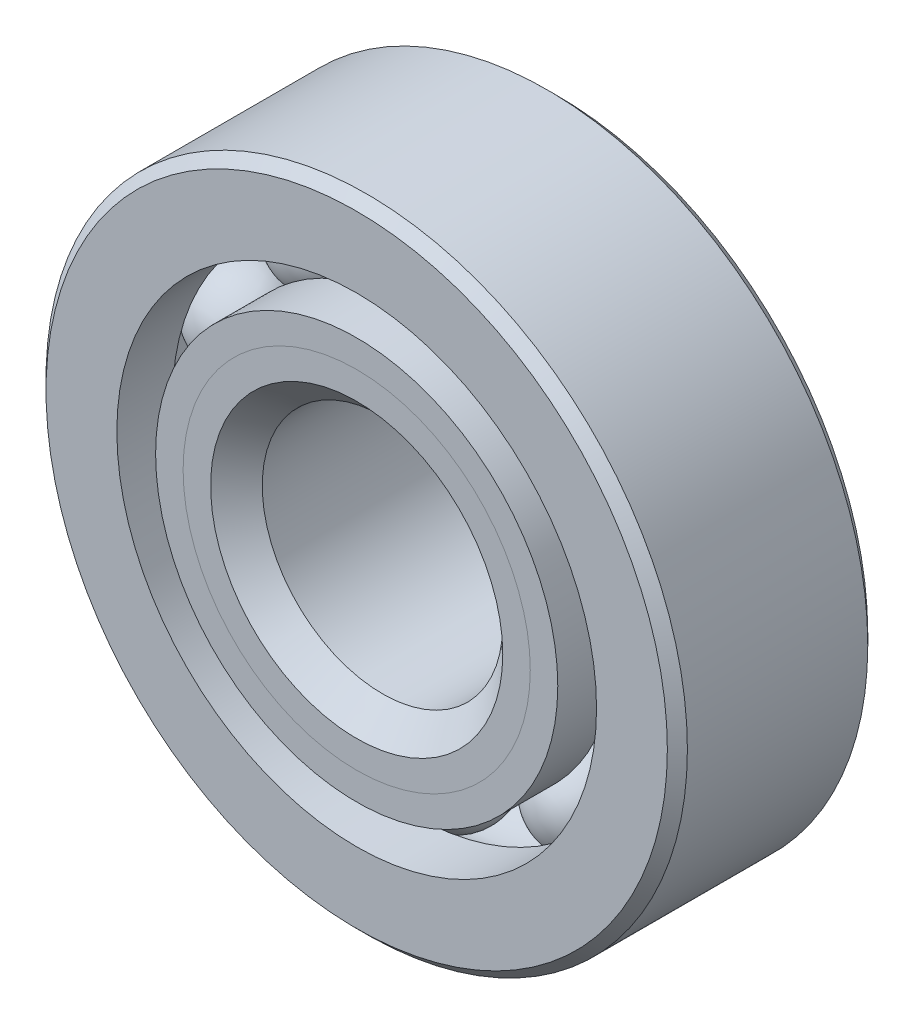
ISO-10303-21;
HEADER;
FILE_DESCRIPTION(('STEP AP214'),'2;1');
FILE_NAME('part.step','',(''),(''),'','','');
FILE_SCHEMA(('AUTOMOTIVE_DESIGN { 1 0 10303 214 1 1 1 1 }'));
ENDSEC;
DATA;
#1=APPLICATION_CONTEXT('core data for automotive mechanical design processes');
#2=APPLICATION_PROTOCOL_DEFINITION('international standard','automotive_design',2000,#1);
#3=PRODUCT_CONTEXT('',#1,'mechanical');
#4=PRODUCT('Part','Part','',(#3));
#5=PRODUCT_RELATED_PRODUCT_CATEGORY('part','',(#4));
#6=PRODUCT_DEFINITION_FORMATION('','',#4);
#7=PRODUCT_DEFINITION_CONTEXT('part definition',#1,'design');
#8=PRODUCT_DEFINITION('design','',#6,#7);
#9=PRODUCT_DEFINITION_SHAPE('','',#8);
#10=(LENGTH_UNIT() NAMED_UNIT(*) SI_UNIT(.MILLI.,.METRE.));
#11=(NAMED_UNIT(*) PLANE_ANGLE_UNIT() SI_UNIT($,.RADIAN.));
#12=(NAMED_UNIT(*) SI_UNIT($,.STERADIAN.) SOLID_ANGLE_UNIT());
#13=UNCERTAINTY_MEASURE_WITH_UNIT(LENGTH_MEASURE(1.E-05),#10,'distance_accuracy_value','');
#14=(GEOMETRIC_REPRESENTATION_CONTEXT(3) GLOBAL_UNCERTAINTY_ASSIGNED_CONTEXT((#13)) GLOBAL_UNIT_ASSIGNED_CONTEXT((#10,
#11,#12)) REPRESENTATION_CONTEXT('',''));
#15=CARTESIAN_POINT('',(0.,0.,0.));
#16=DIRECTION('',(0.,0.,1.));
#17=DIRECTION('',(1.,0.,0.));
#18=AXIS2_PLACEMENT_3D('',#15,#16,#17);
#19=CARTESIAN_POINT('',(-2.56604999203928,3.53186481606816,0.));
#20=DIRECTION('',(0.,0.,1.));
#21=DIRECTION('',(-0.587785252292462,0.809016994374955,0.));
#22=AXIS2_PLACEMENT_3D('',#19,#20,#21);
#23=SPHERICAL_SURFACE('',#22,0.961832467237322);
#24=CARTESIAN_POINT('',(-2.56604999203928,3.53186481606816,0.96183246723732));
#25=VERTEX_POINT('',#24);
#26=VERTEX_LOOP('',#25);
#27=FACE_BOUND('',#26,.T.);
#28=ADVANCED_FACE('F42',(#27),#23,.T.);
#29=CLOSED_SHELL('',(#28));
#30=MANIFOLD_SOLID_BREP('B2',#29);
#31=CARTESIAN_POINT('',(-4.15195610395102,1.34905231606818,0.));
#32=DIRECTION('',(0.,0.,1.));
#33=DIRECTION('',(-0.95105651629515,0.309016994374958,0.));
#34=AXIS2_PLACEMENT_3D('',#31,#32,#33);
#35=SPHERICAL_SURFACE('',#34,0.961832467237322);
#36=CARTESIAN_POINT('',(-4.15195610395102,1.34905231606818,0.96183246723732));
#37=VERTEX_POINT('',#36);
#38=VERTEX_LOOP('',#37);
#39=FACE_BOUND('',#38,.T.);
#40=ADVANCED_FACE('F75',(#39),#35,.T.);
#41=CLOSED_SHELL('',(#40));
#42=MANIFOLD_SOLID_BREP('B6',#41);
#43=CARTESIAN_POINT('',(-4.15195610395104,-1.34905231606809,0.));
#44=DIRECTION('',(0.,0.,1.));
#45=DIRECTION('',(-0.951056516295157,-0.309016994374938,0.));
#46=AXIS2_PLACEMENT_3D('',#43,#44,#45);
#47=SPHERICAL_SURFACE('',#46,0.961832467237322);
#48=CARTESIAN_POINT('',(-4.15195610395104,-1.34905231606809,0.96183246723732));
#49=VERTEX_POINT('',#48);
#50=VERTEX_LOOP('',#49);
#51=FACE_BOUND('',#50,.T.);
#52=ADVANCED_FACE('F108',(#51),#47,.T.);
#53=CLOSED_SHELL('',(#52));
#54=MANIFOLD_SOLID_BREP('B38',#53);
#55=CARTESIAN_POINT('',(-2.56604999203936,-3.53186481606811,0.));
#56=DIRECTION('',(0.,0.,1.));
#57=DIRECTION('',(-0.58778525229248,-0.809016994374942,0.));
#58=AXIS2_PLACEMENT_3D('',#55,#56,#57);
#59=SPHERICAL_SURFACE('',#58,0.961832467237322);
#60=CARTESIAN_POINT('',(-2.56604999203936,-3.53186481606811,0.96183246723732));
#61=VERTEX_POINT('',#60);
#62=VERTEX_LOOP('',#61);
#63=FACE_BOUND('',#62,.T.);
#64=ADVANCED_FACE('F141',(#63),#59,.T.);
#65=CLOSED_SHELL('',(#64));
#66=MANIFOLD_SOLID_BREP('B71',#65);
#67=CARTESIAN_POINT('',(0.,-4.365625,0.));
#68=DIRECTION('',(0.,0.,1.));
#69=DIRECTION('',(0.,-1.,0.));
#70=AXIS2_PLACEMENT_3D('',#67,#68,#69);
#71=SPHERICAL_SURFACE('',#70,0.961832467237322);
#72=CARTESIAN_POINT('',(0.,-4.365625,0.96183246723732));
#73=VERTEX_POINT('',#72);
#74=VERTEX_LOOP('',#73);
#75=FACE_BOUND('',#74,.T.);
#76=ADVANCED_FACE('F174',(#75),#71,.T.);
#77=CLOSED_SHELL('',(#76));
#78=MANIFOLD_SOLID_BREP('B104',#77);
#79=CARTESIAN_POINT('',(2.56604999203931,-3.53186481606815,0.));
#80=DIRECTION('',(0.,0.,1.));
#81=DIRECTION('',(0.587785252292469,-0.809016994374951,0.));
#82=AXIS2_PLACEMENT_3D('',#79,#80,#81);
#83=SPHERICAL_SURFACE('',#82,0.961832467237322);
#84=CARTESIAN_POINT('',(2.56604999203931,-3.53186481606815,0.96183246723732));
#85=VERTEX_POINT('',#84);
#86=VERTEX_LOOP('',#85);
#87=FACE_BOUND('',#86,.T.);
#88=ADVANCED_FACE('F207',(#87),#83,.T.);
#89=CLOSED_SHELL('',(#88));
#90=MANIFOLD_SOLID_BREP('B137',#89);
#91=CARTESIAN_POINT('',(4.15195610395103,-1.34905231606815,0.));
#92=DIRECTION('',(0.,0.,1.));
#93=DIRECTION('',(0.951056516295152,-0.309016994374952,0.));
#94=AXIS2_PLACEMENT_3D('',#91,#92,#93);
#95=SPHERICAL_SURFACE('',#94,0.961832467237322);
#96=CARTESIAN_POINT('',(4.15195610395103,-1.34905231606815,0.96183246723732));
#97=VERTEX_POINT('',#96);
#98=VERTEX_LOOP('',#97);
#99=FACE_BOUND('',#98,.T.);
#100=ADVANCED_FACE('F240',(#99),#95,.T.);
#101=CLOSED_SHELL('',(#100));
#102=MANIFOLD_SOLID_BREP('B170',#101);
#103=CARTESIAN_POINT('',(4.15195610395104,1.34905231606812,0.));
#104=DIRECTION('',(0.,0.,1.));
#105=DIRECTION('',(0.951056516295155,0.309016994374945,0.));
#106=AXIS2_PLACEMENT_3D('',#103,#104,#105);
#107=SPHERICAL_SURFACE('',#106,0.961832467237322);
#108=CARTESIAN_POINT('',(4.15195610395104,1.34905231606812,0.96183246723732));
#109=VERTEX_POINT('',#108);
#110=VERTEX_LOOP('',#109);
#111=FACE_BOUND('',#110,.T.);
#112=ADVANCED_FACE('F273',(#111),#107,.T.);
#113=CLOSED_SHELL('',(#112));
#114=MANIFOLD_SOLID_BREP('B203',#113);
#115=CARTESIAN_POINT('',(2.56604999203933,3.53186481606813,0.));
#116=DIRECTION('',(0.,0.,1.));
#117=DIRECTION('',(0.587785252292474,0.809016994374947,0.));
#118=AXIS2_PLACEMENT_3D('',#115,#116,#117);
#119=SPHERICAL_SURFACE('',#118,0.961832467237322);
#120=CARTESIAN_POINT('',(2.56604999203933,3.53186481606813,0.96183246723732));
#121=VERTEX_POINT('',#120);
#122=VERTEX_LOOP('',#121);
#123=FACE_BOUND('',#122,.T.);
#124=ADVANCED_FACE('F306',(#123),#119,.T.);
#125=CLOSED_SHELL('',(#124));
#126=MANIFOLD_SOLID_BREP('B236',#125);
#127=CARTESIAN_POINT('',(0.,4.365625,0.));
#128=DIRECTION('',(0.,0.,1.));
#129=DIRECTION('',(0.,1.,0.));
#130=AXIS2_PLACEMENT_3D('',#127,#128,#129);
#131=SPHERICAL_SURFACE('',#130,0.961832467237322);
#132=CARTESIAN_POINT('',(0.,4.365625,0.96183246723732));
#133=VERTEX_POINT('',#132);
#134=VERTEX_LOOP('',#133);
#135=FACE_BOUND('',#134,.T.);
#136=ADVANCED_FACE('F341',(#135),#131,.T.);
#137=CLOSED_SHELL('',(#136));
#138=MANIFOLD_SOLID_BREP('B269',#137);
#139=CARTESIAN_POINT('',(0.,3.43717752879507,1.984375));
#140=DIRECTION('',(0.,0.,-1.));
#141=DIRECTION('',(-1.,0.,0.));
#142=AXIS2_PLACEMENT_3D('',#139,#140,#141);
#143=PLANE('',#142);
#144=CARTESIAN_POINT('',(0.,0.,1.984375));
#145=DIRECTION('',(0.,0.,1.));
#146=DIRECTION('',(1.,0.,0.));
#147=AXIS2_PLACEMENT_3D('',#144,#145,#146);
#148=CIRCLE('',#147,2.89252126638134);
#149=CARTESIAN_POINT('',(2.89252126638134,0.,1.984375));
#150=VERTEX_POINT('',#149);
#151=EDGE_CURVE('E396',#150,#150,#148,.T.);
#152=ORIENTED_EDGE('',*,*,#151,.F.);
#153=EDGE_LOOP('',(#152));
#154=FACE_BOUND('',#153,.T.);
#155=CARTESIAN_POINT('',(0.,0.,1.984375));
#156=DIRECTION('',(0.,0.,1.));
#157=DIRECTION('',(1.,0.,0.));
#158=AXIS2_PLACEMENT_3D('',#155,#156,#157);
#159=CIRCLE('',#158,3.43717752879507);
#160=CARTESIAN_POINT('',(3.43717752879507,0.,1.984375));
#161=VERTEX_POINT('',#160);
#162=EDGE_CURVE('E340',#161,#161,#159,.T.);
#163=ORIENTED_EDGE('',*,*,#162,.T.);
#164=EDGE_LOOP('',(#163));
#165=FACE_BOUND('',#164,.T.);
#166=ADVANCED_FACE('F362',(#154,#165),#143,.F.);
#167=CARTESIAN_POINT('',(0.,0.,1.43971873758627));
#168=DIRECTION('',(0.,0.,1.));
#169=DIRECTION('',(1.,0.,0.));
#170=AXIS2_PLACEMENT_3D('',#167,#168,#169);
#171=CONICAL_SURFACE('',#170,2.89252126638134,0.785398163397451);
#172=ORIENTED_EDGE('',*,*,#162,.F.);
#173=EDGE_LOOP('',(#172));
#174=FACE_BOUND('',#173,.T.);
#175=CARTESIAN_POINT('',(0.,0.,1.43971873758627));
#176=DIRECTION('',(0.,0.,1.));
#177=DIRECTION('',(1.,0.,0.));
#178=AXIS2_PLACEMENT_3D('',#175,#176,#177);
#179=CIRCLE('',#178,2.89252126638134);
#180=CARTESIAN_POINT('',(2.89252126638134,0.,1.43971873758627));
#181=VERTEX_POINT('',#180);
#182=EDGE_CURVE('E368',#181,#181,#179,.T.);
#183=ORIENTED_EDGE('',*,*,#182,.T.);
#184=EDGE_LOOP('',(#183));
#185=FACE_BOUND('',#184,.T.);
#186=ADVANCED_FACE('F403',(#174,#185),#171,.T.);
#187=CARTESIAN_POINT('',(0.,0.,1.984375));
#188=DIRECTION('',(0.,0.,1.));
#189=DIRECTION('',(1.,0.,0.));
#190=AXIS2_PLACEMENT_3D('',#187,#188,#189);
#191=CYLINDRICAL_SURFACE('',#190,2.89252126638134);
#192=ORIENTED_EDGE('',*,*,#182,.F.);
#193=EDGE_LOOP('',(#192));
#194=FACE_BOUND('',#193,.T.);
#195=CARTESIAN_POINT('',(0.,0.,0.));
#196=DIRECTION('',(0.,0.,1.));
#197=DIRECTION('',(1.,0.,0.));
#198=AXIS2_PLACEMENT_3D('',#195,#196,#197);
#199=CIRCLE('',#198,2.89252126638134);
#200=CARTESIAN_POINT('',(2.89252126638134,0.,0.));
#201=VERTEX_POINT('',#200);
#202=EDGE_CURVE('E372',#201,#201,#199,.T.);
#203=ORIENTED_EDGE('',*,*,#202,.T.);
#204=EDGE_LOOP('',(#203));
#205=FACE_BOUND('',#204,.T.);
#206=ADVANCED_FACE('F407',(#194,#205),#191,.T.);
#207=CARTESIAN_POINT('',(0.,2.89252126638134,0.));
#208=DIRECTION('',(0.,0.,-1.));
#209=DIRECTION('',(-1.,0.,0.));
#210=AXIS2_PLACEMENT_3D('',#207,#208,#209);
#211=PLANE('',#210);
#212=ORIENTED_EDGE('',*,*,#202,.F.);
#213=EDGE_LOOP('',(#212));
#214=FACE_BOUND('',#213,.T.);
#215=CARTESIAN_POINT('',(0.,0.,0.));
#216=DIRECTION('',(0.,0.,1.));
#217=DIRECTION('',(1.,0.,0.));
#218=AXIS2_PLACEMENT_3D('',#215,#216,#217);
#219=CIRCLE('',#218,3.40379253276268);
#220=CARTESIAN_POINT('',(3.40379253276268,0.,0.));
#221=VERTEX_POINT('',#220);
#222=EDGE_CURVE('E376',#221,#221,#219,.T.);
#223=ORIENTED_EDGE('',*,*,#222,.T.);
#224=EDGE_LOOP('',(#223));
#225=FACE_BOUND('',#224,.T.);
#226=ADVANCED_FACE('F412',(#214,#225),#211,.F.);
#227=CARTESIAN_POINT('',(0.,0.,0.));
#228=DIRECTION('',(0.,0.,1.));
#229=DIRECTION('',(1.,0.,0.));
#230=AXIS2_PLACEMENT_3D('',#227,#228,#229);
#231=TOROIDAL_SURFACE('',#230,4.365625,0.96183246723732);
#232=ORIENTED_EDGE('',*,*,#222,.F.);
#233=EDGE_LOOP('',(#232));
#234=FACE_BOUND('',#233,.T.);
#235=CARTESIAN_POINT('',(0.,0.,-0.881944444444445));
#236=DIRECTION('',(0.,0.,1.));
#237=DIRECTION('',(1.,0.,0.));
#238=AXIS2_PLACEMENT_3D('',#235,#236,#237);
#239=CIRCLE('',#238,3.9818337912088);
#240=CARTESIAN_POINT('',(3.9818337912088,0.,-0.881944444444445));
#241=VERTEX_POINT('',#240);
#242=EDGE_CURVE('E381',#241,#241,#239,.T.);
#243=ORIENTED_EDGE('',*,*,#242,.T.);
#244=EDGE_LOOP('',(#243));
#245=FACE_BOUND('',#244,.T.);
#246=ADVANCED_FACE('F418',(#234,#245),#231,.F.);
#247=CARTESIAN_POINT('',(0.,0.,1.984375));
#248=DIRECTION('',(0.,0.,1.));
#249=DIRECTION('',(1.,0.,0.));
#250=AXIS2_PLACEMENT_3D('',#247,#248,#249);
#251=CYLINDRICAL_SURFACE('',#250,3.9818337912088);
#252=ORIENTED_EDGE('',*,*,#242,.F.);
#253=EDGE_LOOP('',(#252));
#254=FACE_BOUND('',#253,.T.);
#255=CARTESIAN_POINT('',(0.,0.,-1.98437500000001));
#256=DIRECTION('',(0.,0.,1.));
#257=DIRECTION('',(1.,0.,0.));
#258=AXIS2_PLACEMENT_3D('',#255,#256,#257);
#259=CIRCLE('',#258,3.9818337912088);
#260=CARTESIAN_POINT('',(3.9818337912088,0.,-1.98437500000001));
#261=VERTEX_POINT('',#260);
#262=EDGE_CURVE('E384',#261,#261,#259,.T.);
#263=ORIENTED_EDGE('',*,*,#262,.T.);
#264=EDGE_LOOP('',(#263));
#265=FACE_BOUND('',#264,.T.);
#266=ADVANCED_FACE('F422',(#254,#265),#251,.T.);
#267=CARTESIAN_POINT('',(0.,2.5796875,-1.98437500000001));
#268=DIRECTION('',(0.,0.,1.));
#269=DIRECTION('',(1.,0.,0.));
#270=AXIS2_PLACEMENT_3D('',#267,#268,#269);
#271=PLANE('',#270);
#272=ORIENTED_EDGE('',*,*,#262,.F.);
#273=EDGE_LOOP('',(#272));
#274=FACE_BOUND('',#273,.T.);
#275=CARTESIAN_POINT('',(0.,0.,-1.98437500000001));
#276=DIRECTION('',(0.,0.,1.));
#277=DIRECTION('',(1.,0.,0.));
#278=AXIS2_PLACEMENT_3D('',#275,#276,#277);
#279=CIRCLE('',#278,2.5796875);
#280=CARTESIAN_POINT('',(2.5796875,0.,-1.98437500000001));
#281=VERTEX_POINT('',#280);
#282=EDGE_CURVE('E387',#281,#281,#279,.T.);
#283=ORIENTED_EDGE('',*,*,#282,.T.);
#284=EDGE_LOOP('',(#283));
#285=FACE_BOUND('',#284,.T.);
#286=ADVANCED_FACE('F426',(#274,#285),#271,.F.);
#287=CARTESIAN_POINT('',(0.,0.,-1.78593750000001));
#288=DIRECTION('',(0.,0.,-1.));
#289=DIRECTION('',(-1.,0.,0.));
#290=AXIS2_PLACEMENT_3D('',#287,#288,#289);
#291=CONICAL_SURFACE('',#290,2.38125,0.785398163397446);
#292=ORIENTED_EDGE('',*,*,#282,.F.);
#293=EDGE_LOOP('',(#292));
#294=FACE_BOUND('',#293,.T.);
#295=CARTESIAN_POINT('',(0.,0.,-1.78593750000001));
#296=DIRECTION('',(0.,0.,1.));
#297=DIRECTION('',(1.,0.,0.));
#298=AXIS2_PLACEMENT_3D('',#295,#296,#297);
#299=CIRCLE('',#298,2.38125);
#300=CARTESIAN_POINT('',(2.38125,0.,-1.78593750000001));
#301=VERTEX_POINT('',#300);
#302=EDGE_CURVE('E390',#301,#301,#299,.T.);
#303=ORIENTED_EDGE('',*,*,#302,.T.);
#304=EDGE_LOOP('',(#303));
#305=FACE_BOUND('',#304,.T.);
#306=ADVANCED_FACE('F430',(#294,#305),#291,.F.);
#307=CARTESIAN_POINT('',(0.,0.,1.984375));
#308=DIRECTION('',(0.,0.,1.));
#309=DIRECTION('',(1.,0.,0.));
#310=AXIS2_PLACEMENT_3D('',#307,#308,#309);
#311=CYLINDRICAL_SURFACE('',#310,2.38125);
#312=ORIENTED_EDGE('',*,*,#302,.F.);
#313=EDGE_LOOP('',(#312));
#314=FACE_BOUND('',#313,.T.);
#315=CARTESIAN_POINT('',(0.,0.,1.47310373361866));
#316=DIRECTION('',(0.,0.,1.));
#317=DIRECTION('',(1.,0.,0.));
#318=AXIS2_PLACEMENT_3D('',#315,#316,#317);
#319=CIRCLE('',#318,2.38125);
#320=CARTESIAN_POINT('',(2.38125,0.,1.47310373361866));
#321=VERTEX_POINT('',#320);
#322=EDGE_CURVE('E393',#321,#321,#319,.T.);
#323=ORIENTED_EDGE('',*,*,#322,.T.);
#324=EDGE_LOOP('',(#323));
#325=FACE_BOUND('',#324,.T.);
#326=ADVANCED_FACE('F434',(#314,#325),#311,.F.);
#327=CARTESIAN_POINT('',(0.,0.,1.984375));
#328=DIRECTION('',(0.,0.,1.));
#329=DIRECTION('',(1.,0.,0.));
#330=AXIS2_PLACEMENT_3D('',#327,#328,#329);
#331=CONICAL_SURFACE('',#330,2.89252126638134,0.785398163397451);
#332=ORIENTED_EDGE('',*,*,#322,.F.);
#333=EDGE_LOOP('',(#332));
#334=FACE_BOUND('',#333,.T.);
#335=ORIENTED_EDGE('',*,*,#151,.T.);
#336=EDGE_LOOP('',(#335));
#337=FACE_BOUND('',#336,.T.);
#338=ADVANCED_FACE('F400',(#334,#337),#331,.F.);
#339=CLOSED_SHELL('',(#166,#186,#206,#226,#246,#266,#286,#306,#326,#338));
#340=MANIFOLD_SOLID_BREP('B302',#339);
#341=CARTESIAN_POINT('',(0.,3.9818337912088,1.984375));
#342=DIRECTION('',(0.,0.,-1.));
#343=DIRECTION('',(-1.,0.,0.));
#344=AXIS2_PLACEMENT_3D('',#341,#342,#343);
#345=PLANE('',#344);
#346=CARTESIAN_POINT('',(0.,0.,1.984375));
#347=DIRECTION('',(0.,0.,1.));
#348=DIRECTION('',(1.,0.,0.));
#349=AXIS2_PLACEMENT_3D('',#346,#347,#348);
#350=CIRCLE('',#349,3.43717752879507);
#351=CARTESIAN_POINT('',(3.43717752879507,0.,1.984375));
#352=VERTEX_POINT('',#351);
#353=EDGE_CURVE('E361',#352,#352,#350,.T.);
#354=ORIENTED_EDGE('',*,*,#353,.F.);
#355=EDGE_LOOP('',(#354));
#356=FACE_BOUND('',#355,.T.);
#357=CARTESIAN_POINT('',(0.,0.,1.984375));
#358=DIRECTION('',(0.,0.,1.));
#359=DIRECTION('',(1.,0.,0.));
#360=AXIS2_PLACEMENT_3D('',#357,#358,#359);
#361=CIRCLE('',#360,3.9818337912088);
#362=CARTESIAN_POINT('',(3.9818337912088,0.,1.984375));
#363=VERTEX_POINT('',#362);
#364=EDGE_CURVE('E543',#363,#363,#361,.T.);
#365=ORIENTED_EDGE('',*,*,#364,.T.);
#366=EDGE_LOOP('',(#365));
#367=FACE_BOUND('',#366,.T.);
#368=ADVANCED_FACE('F521',(#356,#367),#345,.F.);
#369=CARTESIAN_POINT('',(0.,0.,1.984375));
#370=DIRECTION('',(0.,0.,1.));
#371=DIRECTION('',(1.,0.,0.));
#372=AXIS2_PLACEMENT_3D('',#369,#370,#371);
#373=CONICAL_SURFACE('',#372,3.43717752879507,0.785398163397451);
#374=CARTESIAN_POINT('',(0.,0.,1.43971873758627));
#375=DIRECTION('',(0.,0.,1.));
#376=DIRECTION('',(1.,0.,0.));
#377=AXIS2_PLACEMENT_3D('',#374,#375,#376);
#378=CIRCLE('',#377,2.89252126638134);
#379=CARTESIAN_POINT('',(2.89252126638134,0.,1.43971873758627));
#380=VERTEX_POINT('',#379);
#381=EDGE_CURVE('E527',#380,#380,#378,.T.);
#382=ORIENTED_EDGE('',*,*,#381,.F.);
#383=EDGE_LOOP('',(#382));
#384=FACE_BOUND('',#383,.T.);
#385=ORIENTED_EDGE('',*,*,#353,.T.);
#386=EDGE_LOOP('',(#385));
#387=FACE_BOUND('',#386,.T.);
#388=ADVANCED_FACE('F568',(#384,#387),#373,.F.);
#389=CARTESIAN_POINT('',(0.,0.,1.984375));
#390=DIRECTION('',(0.,0.,1.));
#391=DIRECTION('',(1.,0.,0.));
#392=AXIS2_PLACEMENT_3D('',#389,#390,#391);
#393=CYLINDRICAL_SURFACE('',#392,2.89252126638134);
#394=CARTESIAN_POINT('',(0.,0.,0.));
#395=DIRECTION('',(0.,0.,1.));
#396=DIRECTION('',(1.,0.,0.));
#397=AXIS2_PLACEMENT_3D('',#394,#395,#396);
#398=CIRCLE('',#397,2.89252126638134);
#399=CARTESIAN_POINT('',(2.89252126638134,0.,0.));
#400=VERTEX_POINT('',#399);
#401=EDGE_CURVE('E531',#400,#400,#398,.T.);
#402=ORIENTED_EDGE('',*,*,#401,.F.);
#403=EDGE_LOOP('',(#402));
#404=FACE_BOUND('',#403,.T.);
#405=ORIENTED_EDGE('',*,*,#381,.T.);
#406=EDGE_LOOP('',(#405));
#407=FACE_BOUND('',#406,.T.);
#408=ADVANCED_FACE('F563',(#404,#407),#393,.F.);
#409=CARTESIAN_POINT('',(0.,2.89252126638134,0.));
#410=DIRECTION('',(0.,0.,1.));
#411=DIRECTION('',(1.,0.,0.));
#412=AXIS2_PLACEMENT_3D('',#409,#410,#411);
#413=PLANE('',#412);
#414=CARTESIAN_POINT('',(0.,0.,0.));
#415=DIRECTION('',(0.,0.,1.));
#416=DIRECTION('',(1.,0.,0.));
#417=AXIS2_PLACEMENT_3D('',#414,#415,#416);
#418=CIRCLE('',#417,3.40379253276268);
#419=CARTESIAN_POINT('',(3.40379253276268,0.,0.));
#420=VERTEX_POINT('',#419);
#421=EDGE_CURVE('E535',#420,#420,#418,.T.);
#422=ORIENTED_EDGE('',*,*,#421,.F.);
#423=EDGE_LOOP('',(#422));
#424=FACE_BOUND('',#423,.T.);
#425=ORIENTED_EDGE('',*,*,#401,.T.);
#426=EDGE_LOOP('',(#425));
#427=FACE_BOUND('',#426,.T.);
#428=ADVANCED_FACE('F557',(#424,#427),#413,.F.);
#429=CARTESIAN_POINT('',(0.,0.,0.));
#430=DIRECTION('',(0.,0.,1.));
#431=DIRECTION('',(1.,0.,0.));
#432=AXIS2_PLACEMENT_3D('',#429,#430,#431);
#433=TOROIDAL_SURFACE('',#432,4.365625,0.961832467237322);
#434=CARTESIAN_POINT('',(0.,0.,0.881944444444442));
#435=DIRECTION('',(0.,0.,1.));
#436=DIRECTION('',(1.,0.,0.));
#437=AXIS2_PLACEMENT_3D('',#434,#435,#436);
#438=CIRCLE('',#437,3.9818337912088);
#439=CARTESIAN_POINT('',(3.9818337912088,0.,0.881944444444442));
#440=VERTEX_POINT('',#439);
#441=EDGE_CURVE('E540',#440,#440,#438,.T.);
#442=ORIENTED_EDGE('',*,*,#441,.F.);
#443=EDGE_LOOP('',(#442));
#444=FACE_BOUND('',#443,.T.);
#445=ORIENTED_EDGE('',*,*,#421,.T.);
#446=EDGE_LOOP('',(#445));
#447=FACE_BOUND('',#446,.T.);
#448=ADVANCED_FACE('F551',(#444,#447),#433,.F.);
#449=CARTESIAN_POINT('',(0.,0.,1.984375));
#450=DIRECTION('',(0.,0.,1.));
#451=DIRECTION('',(1.,0.,0.));
#452=AXIS2_PLACEMENT_3D('',#449,#450,#451);
#453=CYLINDRICAL_SURFACE('',#452,3.9818337912088);
#454=ORIENTED_EDGE('',*,*,#364,.F.);
#455=EDGE_LOOP('',(#454));
#456=FACE_BOUND('',#455,.T.);
#457=ORIENTED_EDGE('',*,*,#441,.T.);
#458=EDGE_LOOP('',(#457));
#459=FACE_BOUND('',#458,.T.);
#460=ADVANCED_FACE('F548',(#456,#459),#453,.T.);
#461=CLOSED_SHELL('',(#368,#388,#408,#428,#448,#460));
#462=MANIFOLD_SOLID_BREP('B335',#461);
#463=CARTESIAN_POINT('',(0.,0.,1.7859375));
#464=DIRECTION('',(0.,0.,-1.));
#465=DIRECTION('',(-1.,0.,0.));
#466=AXIS2_PLACEMENT_3D('',#463,#464,#465);
#467=CONICAL_SURFACE('',#466,6.35,0.785398163397447);
#468=CARTESIAN_POINT('',(0.,0.,1.984375));
#469=DIRECTION('',(0.,0.,1.));
#470=DIRECTION('',(1.,0.,0.));
#471=AXIS2_PLACEMENT_3D('',#468,#469,#470);
#472=CIRCLE('',#471,6.1515625);
#473=CARTESIAN_POINT('',(6.1515625,0.,1.984375));
#474=VERTEX_POINT('',#473);
#475=EDGE_CURVE('E640',#474,#474,#472,.T.);
#476=ORIENTED_EDGE('',*,*,#475,.F.);
#477=EDGE_LOOP('',(#476));
#478=FACE_BOUND('',#477,.T.);
#479=CARTESIAN_POINT('',(0.,0.,1.7859375));
#480=DIRECTION('',(0.,0.,1.));
#481=DIRECTION('',(1.,0.,0.));
#482=AXIS2_PLACEMENT_3D('',#479,#480,#481);
#483=CIRCLE('',#482,6.35);
#484=CARTESIAN_POINT('',(6.35,0.,1.7859375));
#485=VERTEX_POINT('',#484);
#486=EDGE_CURVE('E520',#485,#485,#483,.T.);
#487=ORIENTED_EDGE('',*,*,#486,.T.);
#488=EDGE_LOOP('',(#487));
#489=FACE_BOUND('',#488,.T.);
#490=ADVANCED_FACE('F612',(#478,#489),#467,.T.);
#491=CARTESIAN_POINT('',(0.,0.,1.984375));
#492=DIRECTION('',(0.,0.,1.));
#493=DIRECTION('',(1.,0.,0.));
#494=AXIS2_PLACEMENT_3D('',#491,#492,#493);
#495=CYLINDRICAL_SURFACE('',#494,6.35);
#496=ORIENTED_EDGE('',*,*,#486,.F.);
#497=EDGE_LOOP('',(#496));
#498=FACE_BOUND('',#497,.T.);
#499=CARTESIAN_POINT('',(0.,0.,-1.78593750000001));
#500=DIRECTION('',(0.,0.,1.));
#501=DIRECTION('',(1.,0.,0.));
#502=AXIS2_PLACEMENT_3D('',#499,#500,#501);
#503=CIRCLE('',#502,6.35);
#504=CARTESIAN_POINT('',(6.35,0.,-1.78593750000001));
#505=VERTEX_POINT('',#504);
#506=EDGE_CURVE('E618',#505,#505,#503,.T.);
#507=ORIENTED_EDGE('',*,*,#506,.T.);
#508=EDGE_LOOP('',(#507));
#509=FACE_BOUND('',#508,.T.);
#510=ADVANCED_FACE('F647',(#498,#509),#495,.T.);
#511=CARTESIAN_POINT('',(0.,0.,-1.98437500000001));
#512=DIRECTION('',(0.,0.,1.));
#513=DIRECTION('',(1.,0.,0.));
#514=AXIS2_PLACEMENT_3D('',#511,#512,#513);
#515=CONICAL_SURFACE('',#514,6.1515625,0.785398163397446);
#516=ORIENTED_EDGE('',*,*,#506,.F.);
#517=EDGE_LOOP('',(#516));
#518=FACE_BOUND('',#517,.T.);
#519=CARTESIAN_POINT('',(0.,0.,-1.98437500000001));
#520=DIRECTION('',(0.,0.,1.));
#521=DIRECTION('',(1.,0.,0.));
#522=AXIS2_PLACEMENT_3D('',#519,#520,#521);
#523=CIRCLE('',#522,6.1515625);
#524=CARTESIAN_POINT('',(6.1515625,0.,-1.98437500000001));
#525=VERTEX_POINT('',#524);
#526=EDGE_CURVE('E622',#525,#525,#523,.T.);
#527=ORIENTED_EDGE('',*,*,#526,.T.);
#528=EDGE_LOOP('',(#527));
#529=FACE_BOUND('',#528,.T.);
#530=ADVANCED_FACE('F651',(#518,#529),#515,.T.);
#531=CARTESIAN_POINT('',(0.,6.1515625,-1.984375));
#532=DIRECTION('',(0.,0.,1.));
#533=DIRECTION('',(1.,0.,0.));
#534=AXIS2_PLACEMENT_3D('',#531,#532,#533);
#535=PLANE('',#534);
#536=ORIENTED_EDGE('',*,*,#526,.F.);
#537=EDGE_LOOP('',(#536));
#538=FACE_BOUND('',#537,.T.);
#539=CARTESIAN_POINT('',(0.,0.,-1.984375));
#540=DIRECTION('',(0.,0.,1.));
#541=DIRECTION('',(1.,0.,0.));
#542=AXIS2_PLACEMENT_3D('',#539,#540,#541);
#543=CIRCLE('',#542,4.74941620879121);
#544=CARTESIAN_POINT('',(4.74941620879121,0.,-1.984375));
#545=VERTEX_POINT('',#544);
#546=EDGE_CURVE('E626',#545,#545,#543,.T.);
#547=ORIENTED_EDGE('',*,*,#546,.T.);
#548=EDGE_LOOP('',(#547));
#549=FACE_BOUND('',#548,.T.);
#550=ADVANCED_FACE('F656',(#538,#549),#535,.F.);
#551=CARTESIAN_POINT('',(0.,0.,1.984375));
#552=DIRECTION('',(0.,0.,1.));
#553=DIRECTION('',(1.,0.,0.));
#554=AXIS2_PLACEMENT_3D('',#551,#552,#553);
#555=CYLINDRICAL_SURFACE('',#554,4.74941620879121);
#556=ORIENTED_EDGE('',*,*,#546,.F.);
#557=EDGE_LOOP('',(#556));
#558=FACE_BOUND('',#557,.T.);
#559=CARTESIAN_POINT('',(0.,0.,-0.881944444444447));
#560=DIRECTION('',(0.,0.,1.));
#561=DIRECTION('',(1.,0.,0.));
#562=AXIS2_PLACEMENT_3D('',#559,#560,#561);
#563=CIRCLE('',#562,4.74941620879121);
#564=CARTESIAN_POINT('',(4.74941620879121,0.,-0.881944444444447));
#565=VERTEX_POINT('',#564);
#566=EDGE_CURVE('E631',#565,#565,#563,.T.);
#567=ORIENTED_EDGE('',*,*,#566,.T.);
#568=EDGE_LOOP('',(#567));
#569=FACE_BOUND('',#568,.T.);
#570=ADVANCED_FACE('F662',(#558,#569),#555,.F.);
#571=CARTESIAN_POINT('',(0.,0.,0.));
#572=DIRECTION('',(0.,0.,1.));
#573=DIRECTION('',(1.,0.,0.));
#574=AXIS2_PLACEMENT_3D('',#571,#572,#573);
#575=TOROIDAL_SURFACE('',#574,4.365625,0.961832467237322);
#576=ORIENTED_EDGE('',*,*,#566,.F.);
#577=EDGE_LOOP('',(#576));
#578=FACE_BOUND('',#577,.T.);
#579=CARTESIAN_POINT('',(0.,0.,0.881944444444442));
#580=DIRECTION('',(0.,0.,1.));
#581=DIRECTION('',(1.,0.,0.));
#582=AXIS2_PLACEMENT_3D('',#579,#580,#581);
#583=CIRCLE('',#582,4.74941620879121);
#584=CARTESIAN_POINT('',(4.74941620879121,0.,0.881944444444442));
#585=VERTEX_POINT('',#584);
#586=EDGE_CURVE('E634',#585,#585,#583,.T.);
#587=ORIENTED_EDGE('',*,*,#586,.T.);
#588=EDGE_LOOP('',(#587));
#589=FACE_BOUND('',#588,.T.);
#590=ADVANCED_FACE('F666',(#578,#589),#575,.F.);
#591=CARTESIAN_POINT('',(0.,0.,1.984375));
#592=DIRECTION('',(0.,0.,1.));
#593=DIRECTION('',(1.,0.,0.));
#594=AXIS2_PLACEMENT_3D('',#591,#592,#593);
#595=CYLINDRICAL_SURFACE('',#594,4.74941620879121);
#596=ORIENTED_EDGE('',*,*,#586,.F.);
#597=EDGE_LOOP('',(#596));
#598=FACE_BOUND('',#597,.T.);
#599=CARTESIAN_POINT('',(0.,0.,1.984375));
#600=DIRECTION('',(0.,0.,1.));
#601=DIRECTION('',(1.,0.,0.));
#602=AXIS2_PLACEMENT_3D('',#599,#600,#601);
#603=CIRCLE('',#602,4.74941620879121);
#604=CARTESIAN_POINT('',(4.74941620879121,0.,1.984375));
#605=VERTEX_POINT('',#604);
#606=EDGE_CURVE('E637',#605,#605,#603,.T.);
#607=ORIENTED_EDGE('',*,*,#606,.T.);
#608=EDGE_LOOP('',(#607));
#609=FACE_BOUND('',#608,.T.);
#610=ADVANCED_FACE('F670',(#598,#609),#595,.F.);
#611=CARTESIAN_POINT('',(0.,6.1515625,1.984375));
#612=DIRECTION('',(0.,0.,-1.));
#613=DIRECTION('',(-1.,0.,0.));
#614=AXIS2_PLACEMENT_3D('',#611,#612,#613);
#615=PLANE('',#614);
#616=ORIENTED_EDGE('',*,*,#606,.F.);
#617=EDGE_LOOP('',(#616));
#618=FACE_BOUND('',#617,.T.);
#619=ORIENTED_EDGE('',*,*,#475,.T.);
#620=EDGE_LOOP('',(#619));
#621=FACE_BOUND('',#620,.T.);
#622=ADVANCED_FACE('F644',(#618,#621),#615,.F.);
#623=CLOSED_SHELL('',(#490,#510,#530,#550,#570,#590,#610,#622));
#624=MANIFOLD_SOLID_BREP('B356',#623);
#625=ADVANCED_BREP_SHAPE_REPRESENTATION('',(#18,#30,#42,#54,#66,#78,#90,#102,#114,#126,#138,
#340,#462,#624),#14);
#626=SHAPE_DEFINITION_REPRESENTATION(#9,#625);
ENDSEC;
END-ISO-10303-21;
